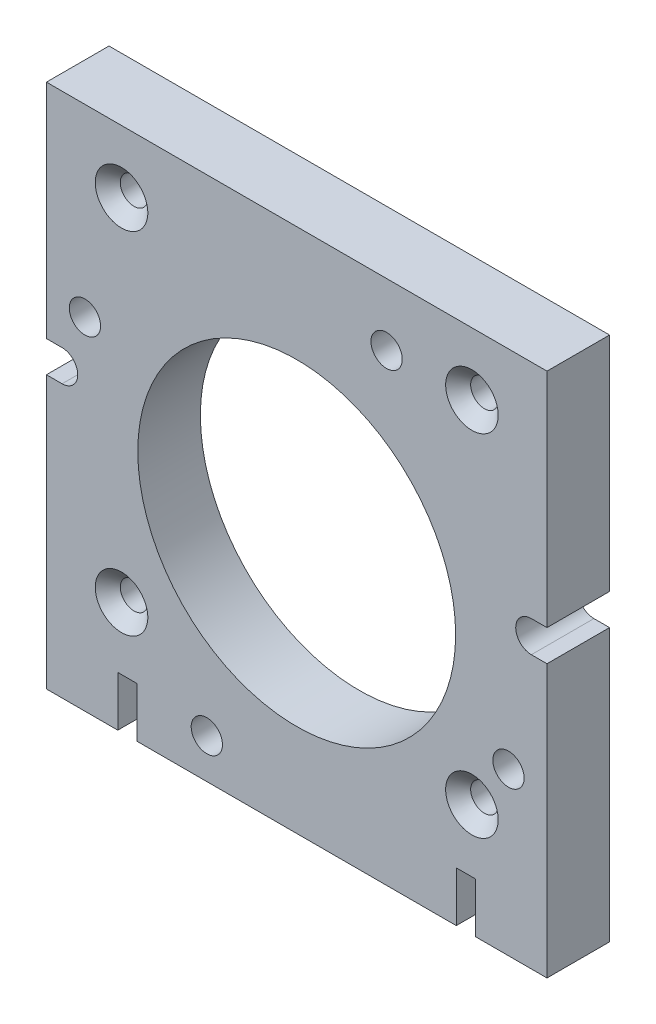
ISO-10303-21;
HEADER;
FILE_DESCRIPTION(('STEP AP214'),'2;1');
FILE_NAME('part.step','',(''),(''),'','','');
FILE_SCHEMA(('AUTOMOTIVE_DESIGN { 1 0 10303 214 1 1 1 1 }'));
ENDSEC;
DATA;
#1=APPLICATION_CONTEXT('core data for automotive mechanical design processes');
#2=APPLICATION_PROTOCOL_DEFINITION('international standard','automotive_design',2000,#1);
#3=PRODUCT_CONTEXT('',#1,'mechanical');
#4=PRODUCT('Part','Part','',(#3));
#5=PRODUCT_RELATED_PRODUCT_CATEGORY('part','',(#4));
#6=PRODUCT_DEFINITION_FORMATION('','',#4);
#7=PRODUCT_DEFINITION_CONTEXT('part definition',#1,'design');
#8=PRODUCT_DEFINITION('design','',#6,#7);
#9=PRODUCT_DEFINITION_SHAPE('','',#8);
#10=(LENGTH_UNIT() NAMED_UNIT(*) SI_UNIT(.MILLI.,.METRE.));
#11=(NAMED_UNIT(*) PLANE_ANGLE_UNIT() SI_UNIT($,.RADIAN.));
#12=(NAMED_UNIT(*) SI_UNIT($,.STERADIAN.) SOLID_ANGLE_UNIT());
#13=UNCERTAINTY_MEASURE_WITH_UNIT(LENGTH_MEASURE(1.E-05),#10,'distance_accuracy_value','');
#14=(GEOMETRIC_REPRESENTATION_CONTEXT(3) GLOBAL_UNCERTAINTY_ASSIGNED_CONTEXT((#13)) GLOBAL_UNIT_ASSIGNED_CONTEXT((#10,
#11,#12)) REPRESENTATION_CONTEXT('',''));
#15=CARTESIAN_POINT('',(0.,0.,0.));
#16=DIRECTION('',(0.,0.,1.));
#17=DIRECTION('',(1.,0.,0.));
#18=AXIS2_PLACEMENT_3D('',#15,#16,#17);
#19=CARTESIAN_POINT('',(20.,10.125,5.));
#20=DIRECTION('',(1.,0.,0.));
#21=DIRECTION('',(0.,1.,0.));
#22=AXIS2_PLACEMENT_3D('',#19,#20,#21);
#23=PLANE('',#22);
#24=DIRECTION('',(0.,-1.,0.));
#25=VECTOR('',#24,1.);
#26=CARTESIAN_POINT('',(20.,10.125,0.));
#27=LINE('',#26,#25);
#28=CARTESIAN_POINT('',(20.,19.,0.));
#29=VERTEX_POINT('',#28);
#30=CARTESIAN_POINT('',(20.,1.25,0.));
#31=VERTEX_POINT('',#30);
#32=EDGE_CURVE('E9',#29,#31,#27,.T.);
#33=ORIENTED_EDGE('',*,*,#32,.F.);
#34=DIRECTION('',(0.,0.,-1.));
#35=VECTOR('',#34,1.);
#36=CARTESIAN_POINT('',(20.,19.,5.));
#37=LINE('',#36,#35);
#38=CARTESIAN_POINT('',(20.,19.,5.));
#39=VERTEX_POINT('',#38);
#40=EDGE_CURVE('E23',#39,#29,#37,.T.);
#41=ORIENTED_EDGE('',*,*,#40,.F.);
#42=DIRECTION('',(0.,-1.,0.));
#43=VECTOR('',#42,1.);
#44=CARTESIAN_POINT('',(20.,10.125,5.));
#45=LINE('',#44,#43);
#46=CARTESIAN_POINT('',(20.,1.25,5.));
#47=VERTEX_POINT('',#46);
#48=EDGE_CURVE('E382',#39,#47,#45,.T.);
#49=ORIENTED_EDGE('',*,*,#48,.T.);
#50=DIRECTION('',(0.,0.,-1.));
#51=VECTOR('',#50,1.);
#52=CARTESIAN_POINT('',(20.,1.25,5.));
#53=LINE('',#52,#51);
#54=EDGE_CURVE('E165',#47,#31,#53,.T.);
#55=ORIENTED_EDGE('',*,*,#54,.T.);
#56=EDGE_LOOP('',(#33,#41,#49,#55));
#57=FACE_BOUND('',#56,.T.);
#58=ADVANCED_FACE('F15',(#57),#23,.T.);
#59=CARTESIAN_POINT('',(0.,19.,5.));
#60=DIRECTION('',(0.,-1.,0.));
#61=DIRECTION('',(1.,0.,0.));
#62=AXIS2_PLACEMENT_3D('',#59,#60,#61);
#63=PLANE('',#62);
#64=DIRECTION('',(-1.,0.,0.));
#65=VECTOR('',#64,1.);
#66=CARTESIAN_POINT('',(0.,19.,0.));
#67=LINE('',#66,#65);
#68=CARTESIAN_POINT('',(-20.,19.,0.));
#69=VERTEX_POINT('',#68);
#70=EDGE_CURVE('E377',#29,#69,#67,.T.);
#71=ORIENTED_EDGE('',*,*,#70,.T.);
#72=DIRECTION('',(0.,0.,-1.));
#73=VECTOR('',#72,1.);
#74=CARTESIAN_POINT('',(-20.,19.,5.));
#75=LINE('',#74,#73);
#76=CARTESIAN_POINT('',(-20.,19.,5.));
#77=VERTEX_POINT('',#76);
#78=EDGE_CURVE('E373',#77,#69,#75,.T.);
#79=ORIENTED_EDGE('',*,*,#78,.F.);
#80=DIRECTION('',(-1.,0.,0.));
#81=VECTOR('',#80,1.);
#82=CARTESIAN_POINT('',(0.,19.,5.));
#83=LINE('',#82,#81);
#84=EDGE_CURVE('E369',#39,#77,#83,.T.);
#85=ORIENTED_EDGE('',*,*,#84,.F.);
#86=ORIENTED_EDGE('',*,*,#40,.T.);
#87=EDGE_LOOP('',(#71,#79,#85,#86));
#88=FACE_BOUND('',#87,.T.);
#89=ADVANCED_FACE('F388',(#88),#63,.F.);
#90=CARTESIAN_POINT('',(-20.,10.125,5.));
#91=DIRECTION('',(1.,0.,0.));
#92=DIRECTION('',(0.,1.,0.));
#93=AXIS2_PLACEMENT_3D('',#90,#91,#92);
#94=PLANE('',#93);
#95=DIRECTION('',(0.,-1.,0.));
#96=VECTOR('',#95,1.);
#97=CARTESIAN_POINT('',(-20.,10.125,0.));
#98=LINE('',#97,#96);
#99=CARTESIAN_POINT('',(-20.,1.25,0.));
#100=VERTEX_POINT('',#99);
#101=EDGE_CURVE('E366',#69,#100,#98,.T.);
#102=ORIENTED_EDGE('',*,*,#101,.T.);
#103=DIRECTION('',(0.,0.,-1.));
#104=VECTOR('',#103,1.);
#105=CARTESIAN_POINT('',(-20.,1.25,5.));
#106=LINE('',#105,#104);
#107=CARTESIAN_POINT('',(-20.,1.25,5.));
#108=VERTEX_POINT('',#107);
#109=EDGE_CURVE('E362',#108,#100,#106,.T.);
#110=ORIENTED_EDGE('',*,*,#109,.F.);
#111=DIRECTION('',(0.,-1.,0.));
#112=VECTOR('',#111,1.);
#113=CARTESIAN_POINT('',(-20.,10.125,5.));
#114=LINE('',#113,#112);
#115=EDGE_CURVE('E358',#77,#108,#114,.T.);
#116=ORIENTED_EDGE('',*,*,#115,.F.);
#117=ORIENTED_EDGE('',*,*,#78,.T.);
#118=EDGE_LOOP('',(#102,#110,#116,#117));
#119=FACE_BOUND('',#118,.T.);
#120=ADVANCED_FACE('F394',(#119),#94,.F.);
#121=CARTESIAN_POINT('',(-19.375,1.25,5.));
#122=DIRECTION('',(0.,-1.,0.));
#123=DIRECTION('',(0.,0.,-1.));
#124=AXIS2_PLACEMENT_3D('',#121,#122,#123);
#125=PLANE('',#124);
#126=DIRECTION('',(-1.,0.,0.));
#127=VECTOR('',#126,1.);
#128=CARTESIAN_POINT('',(-19.375,1.25,0.));
#129=LINE('',#128,#127);
#130=CARTESIAN_POINT('',(-18.75,1.25,0.));
#131=VERTEX_POINT('',#130);
#132=EDGE_CURVE('E354',#131,#100,#129,.T.);
#133=ORIENTED_EDGE('',*,*,#132,.F.);
#134=DIRECTION('',(0.,0.,-1.));
#135=VECTOR('',#134,1.);
#136=CARTESIAN_POINT('',(-18.75,1.25,5.));
#137=LINE('',#136,#135);
#138=CARTESIAN_POINT('',(-18.75,1.25,5.));
#139=VERTEX_POINT('',#138);
#140=EDGE_CURVE('E350',#139,#131,#137,.T.);
#141=ORIENTED_EDGE('',*,*,#140,.F.);
#142=DIRECTION('',(-1.,0.,0.));
#143=VECTOR('',#142,1.);
#144=CARTESIAN_POINT('',(-19.375,1.25,5.));
#145=LINE('',#144,#143);
#146=EDGE_CURVE('E346',#139,#108,#145,.T.);
#147=ORIENTED_EDGE('',*,*,#146,.T.);
#148=ORIENTED_EDGE('',*,*,#109,.T.);
#149=EDGE_LOOP('',(#133,#141,#147,#148));
#150=FACE_BOUND('',#149,.T.);
#151=ADVANCED_FACE('F397',(#150),#125,.T.);
#152=CARTESIAN_POINT('',(-18.75,0.,5.));
#153=DIRECTION('',(0.,0.,-1.));
#154=DIRECTION('',(-1.,0.,0.));
#155=AXIS2_PLACEMENT_3D('',#152,#153,#154);
#156=CYLINDRICAL_SURFACE('',#155,1.25);
#157=CARTESIAN_POINT('',(-18.75,0.,0.));
#158=DIRECTION('',(0.,0.,1.));
#159=DIRECTION('',(1.,0.,0.));
#160=AXIS2_PLACEMENT_3D('',#157,#158,#159);
#161=CIRCLE('',#160,1.25);
#162=CARTESIAN_POINT('',(-18.75,-1.25,0.));
#163=VERTEX_POINT('',#162);
#164=EDGE_CURVE('E342',#163,#131,#161,.T.);
#165=ORIENTED_EDGE('',*,*,#164,.F.);
#166=DIRECTION('',(0.,0.,-1.));
#167=VECTOR('',#166,1.);
#168=CARTESIAN_POINT('',(-18.75,-1.25,5.));
#169=LINE('',#168,#167);
#170=CARTESIAN_POINT('',(-18.75,-1.25,5.));
#171=VERTEX_POINT('',#170);
#172=EDGE_CURVE('E338',#171,#163,#169,.T.);
#173=ORIENTED_EDGE('',*,*,#172,.F.);
#174=CARTESIAN_POINT('',(-18.75,0.,5.));
#175=DIRECTION('',(0.,0.,1.));
#176=DIRECTION('',(1.,0.,0.));
#177=AXIS2_PLACEMENT_3D('',#174,#175,#176);
#178=CIRCLE('',#177,1.25);
#179=EDGE_CURVE('E334',#171,#139,#178,.T.);
#180=ORIENTED_EDGE('',*,*,#179,.T.);
#181=ORIENTED_EDGE('',*,*,#140,.T.);
#182=EDGE_LOOP('',(#165,#173,#180,#181));
#183=FACE_BOUND('',#182,.T.);
#184=ADVANCED_FACE('F538',(#183),#156,.F.);
#185=CARTESIAN_POINT('',(-19.375,-1.25,5.));
#186=DIRECTION('',(0.,-1.,0.));
#187=DIRECTION('',(0.,0.,-1.));
#188=AXIS2_PLACEMENT_3D('',#185,#186,#187);
#189=PLANE('',#188);
#190=DIRECTION('',(-1.,0.,0.));
#191=VECTOR('',#190,1.);
#192=CARTESIAN_POINT('',(-19.375,-1.25,0.));
#193=LINE('',#192,#191);
#194=CARTESIAN_POINT('',(-20.,-1.25,0.));
#195=VERTEX_POINT('',#194);
#196=EDGE_CURVE('E331',#163,#195,#193,.T.);
#197=ORIENTED_EDGE('',*,*,#196,.T.);
#198=DIRECTION('',(0.,0.,-1.));
#199=VECTOR('',#198,1.);
#200=CARTESIAN_POINT('',(-20.,-1.25,5.));
#201=LINE('',#200,#199);
#202=CARTESIAN_POINT('',(-20.,-1.25,5.));
#203=VERTEX_POINT('',#202);
#204=EDGE_CURVE('E327',#203,#195,#201,.T.);
#205=ORIENTED_EDGE('',*,*,#204,.F.);
#206=DIRECTION('',(-1.,0.,0.));
#207=VECTOR('',#206,1.);
#208=CARTESIAN_POINT('',(-19.375,-1.25,5.));
#209=LINE('',#208,#207);
#210=EDGE_CURVE('E323',#171,#203,#209,.T.);
#211=ORIENTED_EDGE('',*,*,#210,.F.);
#212=ORIENTED_EDGE('',*,*,#172,.T.);
#213=EDGE_LOOP('',(#197,#205,#211,#212));
#214=FACE_BOUND('',#213,.T.);
#215=ADVANCED_FACE('F541',(#214),#189,.F.);
#216=CARTESIAN_POINT('',(-20.,-10.125,5.));
#217=DIRECTION('',(1.,0.,0.));
#218=DIRECTION('',(0.,1.,0.));
#219=AXIS2_PLACEMENT_3D('',#216,#217,#218);
#220=PLANE('',#219);
#221=DIRECTION('',(0.,-1.,0.));
#222=VECTOR('',#221,1.);
#223=CARTESIAN_POINT('',(-20.,-10.125,0.));
#224=LINE('',#223,#222);
#225=CARTESIAN_POINT('',(-20.,-23.,0.));
#226=VERTEX_POINT('',#225);
#227=EDGE_CURVE('E320',#195,#226,#224,.T.);
#228=ORIENTED_EDGE('',*,*,#227,.T.);
#229=DIRECTION('',(0.,0.,-1.));
#230=VECTOR('',#229,1.);
#231=CARTESIAN_POINT('',(-20.,-23.,5.));
#232=LINE('',#231,#230);
#233=CARTESIAN_POINT('',(-20.,-23.,5.));
#234=VERTEX_POINT('',#233);
#235=EDGE_CURVE('E316',#234,#226,#232,.T.);
#236=ORIENTED_EDGE('',*,*,#235,.F.);
#237=DIRECTION('',(0.,-1.,0.));
#238=VECTOR('',#237,1.);
#239=CARTESIAN_POINT('',(-20.,-10.125,5.));
#240=LINE('',#239,#238);
#241=EDGE_CURVE('E312',#203,#234,#240,.T.);
#242=ORIENTED_EDGE('',*,*,#241,.F.);
#243=ORIENTED_EDGE('',*,*,#204,.T.);
#244=EDGE_LOOP('',(#228,#236,#242,#243));
#245=FACE_BOUND('',#244,.T.);
#246=ADVANCED_FACE('F545',(#245),#220,.F.);
#247=CARTESIAN_POINT('',(-17.15,-23.,5.));
#248=DIRECTION('',(0.,1.,0.));
#249=DIRECTION('',(0.,0.,1.));
#250=AXIS2_PLACEMENT_3D('',#247,#248,#249);
#251=PLANE('',#250);
#252=DIRECTION('',(1.,0.,0.));
#253=VECTOR('',#252,1.);
#254=CARTESIAN_POINT('',(-17.15,-23.,0.));
#255=LINE('',#254,#253);
#256=CARTESIAN_POINT('',(-14.3,-23.,0.));
#257=VERTEX_POINT('',#256);
#258=EDGE_CURVE('E309',#226,#257,#255,.T.);
#259=ORIENTED_EDGE('',*,*,#258,.T.);
#260=DIRECTION('',(0.,0.,-1.));
#261=VECTOR('',#260,1.);
#262=CARTESIAN_POINT('',(-14.3,-23.,5.));
#263=LINE('',#262,#261);
#264=CARTESIAN_POINT('',(-14.3,-23.,5.));
#265=VERTEX_POINT('',#264);
#266=EDGE_CURVE('E305',#265,#257,#263,.T.);
#267=ORIENTED_EDGE('',*,*,#266,.F.);
#268=DIRECTION('',(1.,0.,0.));
#269=VECTOR('',#268,1.);
#270=CARTESIAN_POINT('',(-17.15,-23.,5.));
#271=LINE('',#270,#269);
#272=EDGE_CURVE('E301',#234,#265,#271,.T.);
#273=ORIENTED_EDGE('',*,*,#272,.F.);
#274=ORIENTED_EDGE('',*,*,#235,.T.);
#275=EDGE_LOOP('',(#259,#267,#273,#274));
#276=FACE_BOUND('',#275,.T.);
#277=ADVANCED_FACE('F549',(#276),#251,.F.);
#278=CARTESIAN_POINT('',(-14.3,-21.,5.));
#279=DIRECTION('',(-1.,0.,0.));
#280=DIRECTION('',(0.,0.,1.));
#281=AXIS2_PLACEMENT_3D('',#278,#279,#280);
#282=PLANE('',#281);
#283=DIRECTION('',(0.,1.,0.));
#284=VECTOR('',#283,1.);
#285=CARTESIAN_POINT('',(-14.3,-21.,0.));
#286=LINE('',#285,#284);
#287=CARTESIAN_POINT('',(-14.3,-19.,0.));
#288=VERTEX_POINT('',#287);
#289=EDGE_CURVE('E298',#257,#288,#286,.T.);
#290=ORIENTED_EDGE('',*,*,#289,.T.);
#291=DIRECTION('',(0.,0.,-1.));
#292=VECTOR('',#291,1.);
#293=CARTESIAN_POINT('',(-14.3,-19.,5.));
#294=LINE('',#293,#292);
#295=CARTESIAN_POINT('',(-14.3,-19.,5.));
#296=VERTEX_POINT('',#295);
#297=EDGE_CURVE('E294',#296,#288,#294,.T.);
#298=ORIENTED_EDGE('',*,*,#297,.F.);
#299=DIRECTION('',(0.,1.,0.));
#300=VECTOR('',#299,1.);
#301=CARTESIAN_POINT('',(-14.3,-21.,5.));
#302=LINE('',#301,#300);
#303=EDGE_CURVE('E290',#265,#296,#302,.T.);
#304=ORIENTED_EDGE('',*,*,#303,.F.);
#305=ORIENTED_EDGE('',*,*,#266,.T.);
#306=EDGE_LOOP('',(#290,#298,#304,#305));
#307=FACE_BOUND('',#306,.T.);
#308=ADVANCED_FACE('F553',(#307),#282,.F.);
#309=CARTESIAN_POINT('',(-13.525,-19.,5.));
#310=DIRECTION('',(0.,1.,0.));
#311=DIRECTION('',(0.,0.,1.));
#312=AXIS2_PLACEMENT_3D('',#309,#310,#311);
#313=PLANE('',#312);
#314=DIRECTION('',(1.,0.,0.));
#315=VECTOR('',#314,1.);
#316=CARTESIAN_POINT('',(-13.525,-19.,0.));
#317=LINE('',#316,#315);
#318=CARTESIAN_POINT('',(-12.75,-19.,0.));
#319=VERTEX_POINT('',#318);
#320=EDGE_CURVE('E287',#288,#319,#317,.T.);
#321=ORIENTED_EDGE('',*,*,#320,.T.);
#322=DIRECTION('',(0.,0.,-1.));
#323=VECTOR('',#322,1.);
#324=CARTESIAN_POINT('',(-12.75,-19.,5.));
#325=LINE('',#324,#323);
#326=CARTESIAN_POINT('',(-12.75,-19.,5.));
#327=VERTEX_POINT('',#326);
#328=EDGE_CURVE('E283',#327,#319,#325,.T.);
#329=ORIENTED_EDGE('',*,*,#328,.F.);
#330=DIRECTION('',(1.,0.,0.));
#331=VECTOR('',#330,1.);
#332=CARTESIAN_POINT('',(-13.525,-19.,5.));
#333=LINE('',#332,#331);
#334=EDGE_CURVE('E279',#296,#327,#333,.T.);
#335=ORIENTED_EDGE('',*,*,#334,.F.);
#336=ORIENTED_EDGE('',*,*,#297,.T.);
#337=EDGE_LOOP('',(#321,#329,#335,#336));
#338=FACE_BOUND('',#337,.T.);
#339=ADVANCED_FACE('F557',(#338),#313,.F.);
#340=CARTESIAN_POINT('',(-12.75,-21.,5.));
#341=DIRECTION('',(-1.,0.,0.));
#342=DIRECTION('',(0.,0.,1.));
#343=AXIS2_PLACEMENT_3D('',#340,#341,#342);
#344=PLANE('',#343);
#345=DIRECTION('',(0.,1.,0.));
#346=VECTOR('',#345,1.);
#347=CARTESIAN_POINT('',(-12.75,-21.,0.));
#348=LINE('',#347,#346);
#349=CARTESIAN_POINT('',(-12.75,-23.,0.));
#350=VERTEX_POINT('',#349);
#351=EDGE_CURVE('E275',#350,#319,#348,.T.);
#352=ORIENTED_EDGE('',*,*,#351,.F.);
#353=DIRECTION('',(0.,0.,-1.));
#354=VECTOR('',#353,1.);
#355=CARTESIAN_POINT('',(-12.75,-23.,5.));
#356=LINE('',#355,#354);
#357=CARTESIAN_POINT('',(-12.75,-23.,5.));
#358=VERTEX_POINT('',#357);
#359=EDGE_CURVE('E271',#358,#350,#356,.T.);
#360=ORIENTED_EDGE('',*,*,#359,.F.);
#361=DIRECTION('',(0.,1.,0.));
#362=VECTOR('',#361,1.);
#363=CARTESIAN_POINT('',(-12.75,-21.,5.));
#364=LINE('',#363,#362);
#365=EDGE_CURVE('E267',#358,#327,#364,.T.);
#366=ORIENTED_EDGE('',*,*,#365,.T.);
#367=ORIENTED_EDGE('',*,*,#328,.T.);
#368=EDGE_LOOP('',(#352,#360,#366,#367));
#369=FACE_BOUND('',#368,.T.);
#370=ADVANCED_FACE('F561',(#369),#344,.T.);
#371=CARTESIAN_POINT('',(0.,-23.,5.));
#372=DIRECTION('',(0.,1.,0.));
#373=DIRECTION('',(0.,0.,1.));
#374=AXIS2_PLACEMENT_3D('',#371,#372,#373);
#375=PLANE('',#374);
#376=DIRECTION('',(1.,0.,0.));
#377=VECTOR('',#376,1.);
#378=CARTESIAN_POINT('',(0.,-23.,0.));
#379=LINE('',#378,#377);
#380=CARTESIAN_POINT('',(12.75,-23.,0.));
#381=VERTEX_POINT('',#380);
#382=EDGE_CURVE('E264',#350,#381,#379,.T.);
#383=ORIENTED_EDGE('',*,*,#382,.T.);
#384=DIRECTION('',(0.,0.,-1.));
#385=VECTOR('',#384,1.);
#386=CARTESIAN_POINT('',(12.75,-23.,5.));
#387=LINE('',#386,#385);
#388=CARTESIAN_POINT('',(12.75,-23.,5.));
#389=VERTEX_POINT('',#388);
#390=EDGE_CURVE('E260',#389,#381,#387,.T.);
#391=ORIENTED_EDGE('',*,*,#390,.F.);
#392=DIRECTION('',(1.,0.,0.));
#393=VECTOR('',#392,1.);
#394=CARTESIAN_POINT('',(0.,-23.,5.));
#395=LINE('',#394,#393);
#396=EDGE_CURVE('E256',#358,#389,#395,.T.);
#397=ORIENTED_EDGE('',*,*,#396,.F.);
#398=ORIENTED_EDGE('',*,*,#359,.T.);
#399=EDGE_LOOP('',(#383,#391,#397,#398));
#400=FACE_BOUND('',#399,.T.);
#401=ADVANCED_FACE('F565',(#400),#375,.F.);
#402=CARTESIAN_POINT('',(12.75,-21.,5.));
#403=DIRECTION('',(-1.,0.,0.));
#404=DIRECTION('',(0.,0.,1.));
#405=AXIS2_PLACEMENT_3D('',#402,#403,#404);
#406=PLANE('',#405);
#407=DIRECTION('',(0.,1.,0.));
#408=VECTOR('',#407,1.);
#409=CARTESIAN_POINT('',(12.75,-21.,0.));
#410=LINE('',#409,#408);
#411=CARTESIAN_POINT('',(12.75,-19.,0.));
#412=VERTEX_POINT('',#411);
#413=EDGE_CURVE('E253',#381,#412,#410,.T.);
#414=ORIENTED_EDGE('',*,*,#413,.T.);
#415=DIRECTION('',(0.,0.,-1.));
#416=VECTOR('',#415,1.);
#417=CARTESIAN_POINT('',(12.75,-19.,5.));
#418=LINE('',#417,#416);
#419=CARTESIAN_POINT('',(12.75,-19.,5.));
#420=VERTEX_POINT('',#419);
#421=EDGE_CURVE('E249',#420,#412,#418,.T.);
#422=ORIENTED_EDGE('',*,*,#421,.F.);
#423=DIRECTION('',(0.,1.,0.));
#424=VECTOR('',#423,1.);
#425=CARTESIAN_POINT('',(12.75,-21.,5.));
#426=LINE('',#425,#424);
#427=EDGE_CURVE('E245',#389,#420,#426,.T.);
#428=ORIENTED_EDGE('',*,*,#427,.F.);
#429=ORIENTED_EDGE('',*,*,#390,.T.);
#430=EDGE_LOOP('',(#414,#422,#428,#429));
#431=FACE_BOUND('',#430,.T.);
#432=ADVANCED_FACE('F569',(#431),#406,.F.);
#433=CARTESIAN_POINT('',(13.525,-19.,5.));
#434=DIRECTION('',(0.,1.,0.));
#435=DIRECTION('',(0.,0.,1.));
#436=AXIS2_PLACEMENT_3D('',#433,#434,#435);
#437=PLANE('',#436);
#438=DIRECTION('',(1.,0.,0.));
#439=VECTOR('',#438,1.);
#440=CARTESIAN_POINT('',(13.525,-19.,0.));
#441=LINE('',#440,#439);
#442=CARTESIAN_POINT('',(14.3,-19.,0.));
#443=VERTEX_POINT('',#442);
#444=EDGE_CURVE('E242',#412,#443,#441,.T.);
#445=ORIENTED_EDGE('',*,*,#444,.T.);
#446=DIRECTION('',(0.,0.,-1.));
#447=VECTOR('',#446,1.);
#448=CARTESIAN_POINT('',(14.3,-19.,5.));
#449=LINE('',#448,#447);
#450=CARTESIAN_POINT('',(14.3,-19.,5.));
#451=VERTEX_POINT('',#450);
#452=EDGE_CURVE('E238',#451,#443,#449,.T.);
#453=ORIENTED_EDGE('',*,*,#452,.F.);
#454=DIRECTION('',(1.,0.,0.));
#455=VECTOR('',#454,1.);
#456=CARTESIAN_POINT('',(13.525,-19.,5.));
#457=LINE('',#456,#455);
#458=EDGE_CURVE('E234',#420,#451,#457,.T.);
#459=ORIENTED_EDGE('',*,*,#458,.F.);
#460=ORIENTED_EDGE('',*,*,#421,.T.);
#461=EDGE_LOOP('',(#445,#453,#459,#460));
#462=FACE_BOUND('',#461,.T.);
#463=ADVANCED_FACE('F573',(#462),#437,.F.);
#464=CARTESIAN_POINT('',(14.3,-21.,5.));
#465=DIRECTION('',(-1.,0.,0.));
#466=DIRECTION('',(0.,0.,1.));
#467=AXIS2_PLACEMENT_3D('',#464,#465,#466);
#468=PLANE('',#467);
#469=DIRECTION('',(0.,1.,0.));
#470=VECTOR('',#469,1.);
#471=CARTESIAN_POINT('',(14.3,-21.,0.));
#472=LINE('',#471,#470);
#473=CARTESIAN_POINT('',(14.3,-23.,0.));
#474=VERTEX_POINT('',#473);
#475=EDGE_CURVE('E230',#474,#443,#472,.T.);
#476=ORIENTED_EDGE('',*,*,#475,.F.);
#477=DIRECTION('',(0.,0.,-1.));
#478=VECTOR('',#477,1.);
#479=CARTESIAN_POINT('',(14.3,-23.,5.));
#480=LINE('',#479,#478);
#481=CARTESIAN_POINT('',(14.3,-23.,5.));
#482=VERTEX_POINT('',#481);
#483=EDGE_CURVE('E226',#482,#474,#480,.T.);
#484=ORIENTED_EDGE('',*,*,#483,.F.);
#485=DIRECTION('',(0.,1.,0.));
#486=VECTOR('',#485,1.);
#487=CARTESIAN_POINT('',(14.3,-21.,5.));
#488=LINE('',#487,#486);
#489=EDGE_CURVE('E222',#482,#451,#488,.T.);
#490=ORIENTED_EDGE('',*,*,#489,.T.);
#491=ORIENTED_EDGE('',*,*,#452,.T.);
#492=EDGE_LOOP('',(#476,#484,#490,#491));
#493=FACE_BOUND('',#492,.T.);
#494=ADVANCED_FACE('F577',(#493),#468,.T.);
#495=CARTESIAN_POINT('',(17.15,-23.,5.));
#496=DIRECTION('',(0.,1.,0.));
#497=DIRECTION('',(0.,0.,1.));
#498=AXIS2_PLACEMENT_3D('',#495,#496,#497);
#499=PLANE('',#498);
#500=DIRECTION('',(1.,0.,0.));
#501=VECTOR('',#500,1.);
#502=CARTESIAN_POINT('',(17.15,-23.,0.));
#503=LINE('',#502,#501);
#504=CARTESIAN_POINT('',(20.,-23.,0.));
#505=VERTEX_POINT('',#504);
#506=EDGE_CURVE('E219',#474,#505,#503,.T.);
#507=ORIENTED_EDGE('',*,*,#506,.T.);
#508=DIRECTION('',(0.,0.,-1.));
#509=VECTOR('',#508,1.);
#510=CARTESIAN_POINT('',(20.,-23.,5.));
#511=LINE('',#510,#509);
#512=CARTESIAN_POINT('',(20.,-23.,5.));
#513=VERTEX_POINT('',#512);
#514=EDGE_CURVE('E215',#513,#505,#511,.T.);
#515=ORIENTED_EDGE('',*,*,#514,.F.);
#516=DIRECTION('',(1.,0.,0.));
#517=VECTOR('',#516,1.);
#518=CARTESIAN_POINT('',(17.15,-23.,5.));
#519=LINE('',#518,#517);
#520=EDGE_CURVE('E211',#482,#513,#519,.T.);
#521=ORIENTED_EDGE('',*,*,#520,.F.);
#522=ORIENTED_EDGE('',*,*,#483,.T.);
#523=EDGE_LOOP('',(#507,#515,#521,#522));
#524=FACE_BOUND('',#523,.T.);
#525=ADVANCED_FACE('F581',(#524),#499,.F.);
#526=CARTESIAN_POINT('',(20.,-21.,5.));
#527=DIRECTION('',(1.,0.,0.));
#528=DIRECTION('',(0.,0.,-1.));
#529=AXIS2_PLACEMENT_3D('',#526,#527,#528);
#530=PLANE('',#529);
#531=DIRECTION('',(0.,-1.,0.));
#532=VECTOR('',#531,1.);
#533=CARTESIAN_POINT('',(20.,-21.,0.));
#534=LINE('',#533,#532);
#535=CARTESIAN_POINT('',(20.,-1.25,0.));
#536=VERTEX_POINT('',#535);
#537=EDGE_CURVE('E207',#536,#505,#534,.T.);
#538=ORIENTED_EDGE('',*,*,#537,.F.);
#539=DIRECTION('',(0.,0.,-1.));
#540=VECTOR('',#539,1.);
#541=CARTESIAN_POINT('',(20.,-1.25,5.));
#542=LINE('',#541,#540);
#543=CARTESIAN_POINT('',(20.,-1.25,5.));
#544=VERTEX_POINT('',#543);
#545=EDGE_CURVE('E203',#544,#536,#542,.T.);
#546=ORIENTED_EDGE('',*,*,#545,.F.);
#547=DIRECTION('',(0.,-1.,0.));
#548=VECTOR('',#547,1.);
#549=CARTESIAN_POINT('',(20.,-21.,5.));
#550=LINE('',#549,#548);
#551=EDGE_CURVE('E199',#544,#513,#550,.T.);
#552=ORIENTED_EDGE('',*,*,#551,.T.);
#553=ORIENTED_EDGE('',*,*,#514,.T.);
#554=EDGE_LOOP('',(#538,#546,#552,#553));
#555=FACE_BOUND('',#554,.T.);
#556=ADVANCED_FACE('F585',(#555),#530,.T.);
#557=CARTESIAN_POINT('',(19.375,-1.25,5.));
#558=DIRECTION('',(0.,1.,0.));
#559=DIRECTION('',(0.,0.,1.));
#560=AXIS2_PLACEMENT_3D('',#557,#558,#559);
#561=PLANE('',#560);
#562=DIRECTION('',(1.,0.,0.));
#563=VECTOR('',#562,1.);
#564=CARTESIAN_POINT('',(19.375,-1.25,0.));
#565=LINE('',#564,#563);
#566=CARTESIAN_POINT('',(18.75,-1.25,0.));
#567=VERTEX_POINT('',#566);
#568=EDGE_CURVE('E195',#567,#536,#565,.T.);
#569=ORIENTED_EDGE('',*,*,#568,.F.);
#570=DIRECTION('',(0.,0.,-1.));
#571=VECTOR('',#570,1.);
#572=CARTESIAN_POINT('',(18.75,-1.25,5.));
#573=LINE('',#572,#571);
#574=CARTESIAN_POINT('',(18.75,-1.25,5.));
#575=VERTEX_POINT('',#574);
#576=EDGE_CURVE('E192',#575,#567,#573,.T.);
#577=ORIENTED_EDGE('',*,*,#576,.F.);
#578=DIRECTION('',(1.,0.,0.));
#579=VECTOR('',#578,1.);
#580=CARTESIAN_POINT('',(19.375,-1.25,5.));
#581=LINE('',#580,#579);
#582=EDGE_CURVE('E176',#575,#544,#581,.T.);
#583=ORIENTED_EDGE('',*,*,#582,.T.);
#584=ORIENTED_EDGE('',*,*,#545,.T.);
#585=EDGE_LOOP('',(#569,#577,#583,#584));
#586=FACE_BOUND('',#585,.T.);
#587=ADVANCED_FACE('F589',(#586),#561,.T.);
#588=CARTESIAN_POINT('',(18.75,0.,5.));
#589=DIRECTION('',(0.,0.,-1.));
#590=DIRECTION('',(-1.,0.,0.));
#591=AXIS2_PLACEMENT_3D('',#588,#589,#590);
#592=CYLINDRICAL_SURFACE('',#591,1.25);
#593=CARTESIAN_POINT('',(18.75,0.,0.));
#594=DIRECTION('',(0.,0.,1.));
#595=DIRECTION('',(1.,0.,0.));
#596=AXIS2_PLACEMENT_3D('',#593,#594,#595);
#597=CIRCLE('',#596,1.25);
#598=CARTESIAN_POINT('',(18.75,1.25,0.));
#599=VERTEX_POINT('',#598);
#600=EDGE_CURVE('E155',#599,#567,#597,.T.);
#601=ORIENTED_EDGE('',*,*,#600,.F.);
#602=DIRECTION('',(0.,0.,-1.));
#603=VECTOR('',#602,1.);
#604=CARTESIAN_POINT('',(18.75,1.25,5.));
#605=LINE('',#604,#603);
#606=CARTESIAN_POINT('',(18.75,1.25,5.));
#607=VERTEX_POINT('',#606);
#608=EDGE_CURVE('E147',#607,#599,#605,.T.);
#609=ORIENTED_EDGE('',*,*,#608,.F.);
#610=CARTESIAN_POINT('',(18.75,0.,5.));
#611=DIRECTION('',(0.,0.,1.));
#612=DIRECTION('',(1.,0.,0.));
#613=AXIS2_PLACEMENT_3D('',#610,#611,#612);
#614=CIRCLE('',#613,1.25);
#615=EDGE_CURVE('E152',#607,#575,#614,.T.);
#616=ORIENTED_EDGE('',*,*,#615,.T.);
#617=ORIENTED_EDGE('',*,*,#576,.T.);
#618=EDGE_LOOP('',(#601,#609,#616,#617));
#619=FACE_BOUND('',#618,.T.);
#620=ADVANCED_FACE('F149',(#619),#592,.F.);
#621=CARTESIAN_POINT('',(0.,-2.9,5.));
#622=DIRECTION('',(0.,0.,-1.));
#623=DIRECTION('',(-1.,0.,0.));
#624=AXIS2_PLACEMENT_3D('',#621,#622,#623);
#625=CYLINDRICAL_SURFACE('',#624,12.7);
#626=CARTESIAN_POINT('',(0.,-2.9,5.));
#627=DIRECTION('',(0.,0.,1.));
#628=DIRECTION('',(1.,0.,0.));
#629=AXIS2_PLACEMENT_3D('',#626,#627,#628);
#630=CIRCLE('',#629,12.7);
#631=CARTESIAN_POINT('',(12.7,-2.9,5.));
#632=VERTEX_POINT('',#631);
#633=EDGE_CURVE('E178',#632,#632,#630,.T.);
#634=ORIENTED_EDGE('',*,*,#633,.T.);
#635=EDGE_LOOP('',(#634));
#636=FACE_BOUND('',#635,.T.);
#637=CARTESIAN_POINT('',(0.,-2.9,0.));
#638=DIRECTION('',(0.,0.,1.));
#639=DIRECTION('',(1.,0.,0.));
#640=AXIS2_PLACEMENT_3D('',#637,#638,#639);
#641=CIRCLE('',#640,12.7);
#642=CARTESIAN_POINT('',(12.7,-2.9,0.));
#643=VERTEX_POINT('',#642);
#644=EDGE_CURVE('E184',#643,#643,#641,.T.);
#645=ORIENTED_EDGE('',*,*,#644,.F.);
#646=EDGE_LOOP('',(#645));
#647=FACE_BOUND('',#646,.T.);
#648=ADVANCED_FACE('F596',(#636,#647),#625,.F.);
#649=CARTESIAN_POINT('',(19.375,1.25,5.));
#650=DIRECTION('',(0.,1.,0.));
#651=DIRECTION('',(0.,0.,1.));
#652=AXIS2_PLACEMENT_3D('',#649,#650,#651);
#653=PLANE('',#652);
#654=DIRECTION('',(1.,0.,0.));
#655=VECTOR('',#654,1.);
#656=CARTESIAN_POINT('',(19.375,1.25,0.));
#657=LINE('',#656,#655);
#658=EDGE_CURVE('E169',#599,#31,#657,.T.);
#659=ORIENTED_EDGE('',*,*,#658,.T.);
#660=ORIENTED_EDGE('',*,*,#54,.F.);
#661=DIRECTION('',(1.,0.,0.));
#662=VECTOR('',#661,1.);
#663=CARTESIAN_POINT('',(19.375,1.25,5.));
#664=LINE('',#663,#662);
#665=EDGE_CURVE('E163',#607,#47,#664,.T.);
#666=ORIENTED_EDGE('',*,*,#665,.F.);
#667=ORIENTED_EDGE('',*,*,#608,.T.);
#668=EDGE_LOOP('',(#659,#660,#666,#667));
#669=FACE_BOUND('',#668,.T.);
#670=ADVANCED_FACE('F164',(#669),#653,.F.);
#671=CARTESIAN_POINT('',(0.,-2.89999999999996,5.));
#672=DIRECTION('',(0.,0.,1.));
#673=DIRECTION('',(1.,0.,0.));
#674=AXIS2_PLACEMENT_3D('',#671,#672,#673);
#675=PLANE('',#674);
#676=CARTESIAN_POINT('',(-14.,-14.,5.));
#677=DIRECTION('',(0.,0.,-1.));
#678=DIRECTION('',(-1.,0.,0.));
#679=AXIS2_PLACEMENT_3D('',#676,#677,#678);
#680=CIRCLE('',#679,2.1);
#681=CARTESIAN_POINT('',(-16.1,-14.,5.));
#682=VERTEX_POINT('',#681);
#683=EDGE_CURVE('E170',#682,#682,#680,.T.);
#684=ORIENTED_EDGE('',*,*,#683,.T.);
#685=EDGE_LOOP('',(#684));
#686=FACE_BOUND('',#685,.T.);
#687=CARTESIAN_POINT('',(14.,-14.,5.));
#688=DIRECTION('',(0.,0.,-1.));
#689=DIRECTION('',(-1.,0.,0.));
#690=AXIS2_PLACEMENT_3D('',#687,#688,#689);
#691=CIRCLE('',#690,2.1);
#692=CARTESIAN_POINT('',(11.9,-14.,5.));
#693=VERTEX_POINT('',#692);
#694=EDGE_CURVE('E409',#693,#693,#691,.T.);
#695=ORIENTED_EDGE('',*,*,#694,.T.);
#696=EDGE_LOOP('',(#695));
#697=FACE_BOUND('',#696,.T.);
#698=CARTESIAN_POINT('',(14.,14.,5.));
#699=DIRECTION('',(0.,0.,-1.));
#700=DIRECTION('',(-1.,0.,0.));
#701=AXIS2_PLACEMENT_3D('',#698,#699,#700);
#702=CIRCLE('',#701,2.1);
#703=CARTESIAN_POINT('',(11.9,14.,5.));
#704=VERTEX_POINT('',#703);
#705=EDGE_CURVE('E413',#704,#704,#702,.T.);
#706=ORIENTED_EDGE('',*,*,#705,.T.);
#707=EDGE_LOOP('',(#706));
#708=FACE_BOUND('',#707,.T.);
#709=CARTESIAN_POINT('',(-14.,14.,5.));
#710=DIRECTION('',(0.,0.,-1.));
#711=DIRECTION('',(-1.,0.,0.));
#712=AXIS2_PLACEMENT_3D('',#709,#710,#711);
#713=CIRCLE('',#712,2.1);
#714=CARTESIAN_POINT('',(-16.1,14.,5.));
#715=VERTEX_POINT('',#714);
#716=EDGE_CURVE('E417',#715,#715,#713,.T.);
#717=ORIENTED_EDGE('',*,*,#716,.T.);
#718=EDGE_LOOP('',(#717));
#719=FACE_BOUND('',#718,.T.);
#720=CARTESIAN_POINT('',(-7.18350439496138,-19.8232758237751,5.));
#721=DIRECTION('',(0.,0.,1.));
#722=DIRECTION('',(1.,0.,0.));
#723=AXIS2_PLACEMENT_3D('',#720,#721,#722);
#724=CIRCLE('',#723,1.25);
#725=CARTESIAN_POINT('',(-5.93350439496138,-19.8232758237751,5.));
#726=VERTEX_POINT('',#725);
#727=EDGE_CURVE('E421',#726,#726,#724,.F.);
#728=ORIENTED_EDGE('',*,*,#727,.T.);
#729=EDGE_LOOP('',(#728));
#730=FACE_BOUND('',#729,.T.);
#731=CARTESIAN_POINT('',(16.9232758237751,-10.0835043949614,5.));
#732=DIRECTION('',(0.,0.,1.));
#733=DIRECTION('',(1.,0.,0.));
#734=AXIS2_PLACEMENT_3D('',#731,#732,#733);
#735=CIRCLE('',#734,1.25);
#736=CARTESIAN_POINT('',(18.1732758237751,-10.0835043949614,5.));
#737=VERTEX_POINT('',#736);
#738=EDGE_CURVE('E425',#737,#737,#735,.F.);
#739=ORIENTED_EDGE('',*,*,#738,.T.);
#740=EDGE_LOOP('',(#739));
#741=FACE_BOUND('',#740,.T.);
#742=CARTESIAN_POINT('',(-16.9232758237751,4.28350439496139,5.));
#743=DIRECTION('',(0.,0.,1.));
#744=DIRECTION('',(1.,0.,0.));
#745=AXIS2_PLACEMENT_3D('',#742,#743,#744);
#746=CIRCLE('',#745,1.25);
#747=CARTESIAN_POINT('',(-15.6732758237751,4.28350439496139,5.));
#748=VERTEX_POINT('',#747);
#749=EDGE_CURVE('E429',#748,#748,#746,.F.);
#750=ORIENTED_EDGE('',*,*,#749,.T.);
#751=EDGE_LOOP('',(#750));
#752=FACE_BOUND('',#751,.T.);
#753=CARTESIAN_POINT('',(7.18350439496138,14.0232758237751,5.));
#754=DIRECTION('',(0.,0.,1.));
#755=DIRECTION('',(1.,0.,0.));
#756=AXIS2_PLACEMENT_3D('',#753,#754,#755);
#757=CIRCLE('',#756,1.25);
#758=CARTESIAN_POINT('',(8.43350439496138,14.0232758237751,5.));
#759=VERTEX_POINT('',#758);
#760=EDGE_CURVE('E433',#759,#759,#757,.F.);
#761=ORIENTED_EDGE('',*,*,#760,.T.);
#762=EDGE_LOOP('',(#761));
#763=FACE_BOUND('',#762,.T.);
#764=ORIENTED_EDGE('',*,*,#48,.F.);
#765=ORIENTED_EDGE('',*,*,#84,.T.);
#766=ORIENTED_EDGE('',*,*,#115,.T.);
#767=ORIENTED_EDGE('',*,*,#146,.F.);
#768=ORIENTED_EDGE('',*,*,#179,.F.);
#769=ORIENTED_EDGE('',*,*,#210,.T.);
#770=ORIENTED_EDGE('',*,*,#241,.T.);
#771=ORIENTED_EDGE('',*,*,#272,.T.);
#772=ORIENTED_EDGE('',*,*,#303,.T.);
#773=ORIENTED_EDGE('',*,*,#334,.T.);
#774=ORIENTED_EDGE('',*,*,#365,.F.);
#775=ORIENTED_EDGE('',*,*,#396,.T.);
#776=ORIENTED_EDGE('',*,*,#427,.T.);
#777=ORIENTED_EDGE('',*,*,#458,.T.);
#778=ORIENTED_EDGE('',*,*,#489,.F.);
#779=ORIENTED_EDGE('',*,*,#520,.T.);
#780=ORIENTED_EDGE('',*,*,#551,.F.);
#781=ORIENTED_EDGE('',*,*,#582,.F.);
#782=ORIENTED_EDGE('',*,*,#615,.F.);
#783=ORIENTED_EDGE('',*,*,#665,.T.);
#784=EDGE_LOOP('',(#764,#765,#766,#767,#768,#769,#770,#771,#772,#773,#774,#775,#776,#777,#778,
#779,#780,#781,#782,#783));
#785=FACE_BOUND('',#784,.T.);
#786=ORIENTED_EDGE('',*,*,#633,.F.);
#787=EDGE_LOOP('',(#786));
#788=FACE_BOUND('',#787,.T.);
#789=ADVANCED_FACE('F172',(#686,#697,#708,#719,#730,#741,#752,#763,#785,#788),#675,.T.);
#790=CARTESIAN_POINT('',(0.,-2.89999999999996,0.));
#791=DIRECTION('',(0.,0.,1.));
#792=DIRECTION('',(1.,0.,0.));
#793=AXIS2_PLACEMENT_3D('',#790,#791,#792);
#794=PLANE('',#793);
#795=CARTESIAN_POINT('',(-14.,-14.,0.));
#796=DIRECTION('',(0.,0.,1.));
#797=DIRECTION('',(1.,0.,0.));
#798=AXIS2_PLACEMENT_3D('',#795,#796,#797);
#799=CIRCLE('',#798,1.1);
#800=CARTESIAN_POINT('',(-12.9,-14.,0.));
#801=VERTEX_POINT('',#800);
#802=EDGE_CURVE('E437',#801,#801,#799,.F.);
#803=ORIENTED_EDGE('',*,*,#802,.F.);
#804=EDGE_LOOP('',(#803));
#805=FACE_BOUND('',#804,.T.);
#806=CARTESIAN_POINT('',(14.,-14.,0.));
#807=DIRECTION('',(0.,0.,1.));
#808=DIRECTION('',(1.,0.,0.));
#809=AXIS2_PLACEMENT_3D('',#806,#807,#808);
#810=CIRCLE('',#809,1.1);
#811=CARTESIAN_POINT('',(15.1,-14.,0.));
#812=VERTEX_POINT('',#811);
#813=EDGE_CURVE('E441',#812,#812,#810,.F.);
#814=ORIENTED_EDGE('',*,*,#813,.F.);
#815=EDGE_LOOP('',(#814));
#816=FACE_BOUND('',#815,.T.);
#817=CARTESIAN_POINT('',(14.,14.,0.));
#818=DIRECTION('',(0.,0.,1.));
#819=DIRECTION('',(1.,0.,0.));
#820=AXIS2_PLACEMENT_3D('',#817,#818,#819);
#821=CIRCLE('',#820,1.1);
#822=CARTESIAN_POINT('',(15.1,14.,0.));
#823=VERTEX_POINT('',#822);
#824=EDGE_CURVE('E445',#823,#823,#821,.F.);
#825=ORIENTED_EDGE('',*,*,#824,.F.);
#826=EDGE_LOOP('',(#825));
#827=FACE_BOUND('',#826,.T.);
#828=CARTESIAN_POINT('',(-14.,14.,0.));
#829=DIRECTION('',(0.,0.,1.));
#830=DIRECTION('',(1.,0.,0.));
#831=AXIS2_PLACEMENT_3D('',#828,#829,#830);
#832=CIRCLE('',#831,1.1);
#833=CARTESIAN_POINT('',(-12.9,14.,0.));
#834=VERTEX_POINT('',#833);
#835=EDGE_CURVE('E449',#834,#834,#832,.F.);
#836=ORIENTED_EDGE('',*,*,#835,.F.);
#837=EDGE_LOOP('',(#836));
#838=FACE_BOUND('',#837,.T.);
#839=CARTESIAN_POINT('',(-7.18350439496138,-19.8232758237751,0.));
#840=DIRECTION('',(0.,0.,1.));
#841=DIRECTION('',(1.,0.,0.));
#842=AXIS2_PLACEMENT_3D('',#839,#840,#841);
#843=CIRCLE('',#842,1.25);
#844=CARTESIAN_POINT('',(-5.93350439496138,-19.8232758237751,0.));
#845=VERTEX_POINT('',#844);
#846=EDGE_CURVE('E453',#845,#845,#843,.T.);
#847=ORIENTED_EDGE('',*,*,#846,.T.);
#848=EDGE_LOOP('',(#847));
#849=FACE_BOUND('',#848,.T.);
#850=CARTESIAN_POINT('',(16.9232758237751,-10.0835043949614,0.));
#851=DIRECTION('',(0.,0.,1.));
#852=DIRECTION('',(1.,0.,0.));
#853=AXIS2_PLACEMENT_3D('',#850,#851,#852);
#854=CIRCLE('',#853,1.25);
#855=CARTESIAN_POINT('',(18.1732758237751,-10.0835043949614,0.));
#856=VERTEX_POINT('',#855);
#857=EDGE_CURVE('E457',#856,#856,#854,.T.);
#858=ORIENTED_EDGE('',*,*,#857,.T.);
#859=EDGE_LOOP('',(#858));
#860=FACE_BOUND('',#859,.T.);
#861=CARTESIAN_POINT('',(-16.9232758237751,4.28350439496139,0.));
#862=DIRECTION('',(0.,0.,1.));
#863=DIRECTION('',(1.,0.,0.));
#864=AXIS2_PLACEMENT_3D('',#861,#862,#863);
#865=CIRCLE('',#864,1.25);
#866=CARTESIAN_POINT('',(-15.6732758237751,4.28350439496139,0.));
#867=VERTEX_POINT('',#866);
#868=EDGE_CURVE('E461',#867,#867,#865,.T.);
#869=ORIENTED_EDGE('',*,*,#868,.T.);
#870=EDGE_LOOP('',(#869));
#871=FACE_BOUND('',#870,.T.);
#872=CARTESIAN_POINT('',(7.18350439496138,14.0232758237751,0.));
#873=DIRECTION('',(0.,0.,1.));
#874=DIRECTION('',(1.,0.,0.));
#875=AXIS2_PLACEMENT_3D('',#872,#873,#874);
#876=CIRCLE('',#875,1.25);
#877=CARTESIAN_POINT('',(8.43350439496138,14.0232758237751,0.));
#878=VERTEX_POINT('',#877);
#879=EDGE_CURVE('E465',#878,#878,#876,.T.);
#880=ORIENTED_EDGE('',*,*,#879,.T.);
#881=EDGE_LOOP('',(#880));
#882=FACE_BOUND('',#881,.T.);
#883=ORIENTED_EDGE('',*,*,#32,.T.);
#884=ORIENTED_EDGE('',*,*,#658,.F.);
#885=ORIENTED_EDGE('',*,*,#600,.T.);
#886=ORIENTED_EDGE('',*,*,#568,.T.);
#887=ORIENTED_EDGE('',*,*,#537,.T.);
#888=ORIENTED_EDGE('',*,*,#506,.F.);
#889=ORIENTED_EDGE('',*,*,#475,.T.);
#890=ORIENTED_EDGE('',*,*,#444,.F.);
#891=ORIENTED_EDGE('',*,*,#413,.F.);
#892=ORIENTED_EDGE('',*,*,#382,.F.);
#893=ORIENTED_EDGE('',*,*,#351,.T.);
#894=ORIENTED_EDGE('',*,*,#320,.F.);
#895=ORIENTED_EDGE('',*,*,#289,.F.);
#896=ORIENTED_EDGE('',*,*,#258,.F.);
#897=ORIENTED_EDGE('',*,*,#227,.F.);
#898=ORIENTED_EDGE('',*,*,#196,.F.);
#899=ORIENTED_EDGE('',*,*,#164,.T.);
#900=ORIENTED_EDGE('',*,*,#132,.T.);
#901=ORIENTED_EDGE('',*,*,#101,.F.);
#902=ORIENTED_EDGE('',*,*,#70,.F.);
#903=EDGE_LOOP('',(#883,#884,#885,#886,#887,#888,#889,#890,#891,#892,#893,#894,#895,#896,#897,
#898,#899,#900,#901,#902));
#904=FACE_BOUND('',#903,.T.);
#905=ORIENTED_EDGE('',*,*,#644,.T.);
#906=EDGE_LOOP('',(#905));
#907=FACE_BOUND('',#906,.T.);
#908=ADVANCED_FACE('F391',(#805,#816,#827,#838,#849,#860,#871,#882,#904,#907),#794,.F.);
#909=CARTESIAN_POINT('',(7.18350439496138,14.0232758237751,0.));
#910=DIRECTION('',(0.,0.,1.));
#911=DIRECTION('',(1.,0.,0.));
#912=AXIS2_PLACEMENT_3D('',#909,#910,#911);
#913=CYLINDRICAL_SURFACE('',#912,1.25);
#914=ORIENTED_EDGE('',*,*,#760,.F.);
#915=EDGE_LOOP('',(#914));
#916=FACE_BOUND('',#915,.T.);
#917=ORIENTED_EDGE('',*,*,#879,.F.);
#918=EDGE_LOOP('',(#917));
#919=FACE_BOUND('',#918,.T.);
#920=ADVANCED_FACE('F499',(#916,#919),#913,.F.);
#921=CARTESIAN_POINT('',(-16.9232758237751,4.28350439496139,0.));
#922=DIRECTION('',(0.,0.,1.));
#923=DIRECTION('',(1.,0.,0.));
#924=AXIS2_PLACEMENT_3D('',#921,#922,#923);
#925=CYLINDRICAL_SURFACE('',#924,1.25);
#926=ORIENTED_EDGE('',*,*,#749,.F.);
#927=EDGE_LOOP('',(#926));
#928=FACE_BOUND('',#927,.T.);
#929=ORIENTED_EDGE('',*,*,#868,.F.);
#930=EDGE_LOOP('',(#929));
#931=FACE_BOUND('',#930,.T.);
#932=ADVANCED_FACE('F516',(#928,#931),#925,.F.);
#933=CARTESIAN_POINT('',(16.9232758237751,-10.0835043949614,0.));
#934=DIRECTION('',(0.,0.,1.));
#935=DIRECTION('',(1.,0.,0.));
#936=AXIS2_PLACEMENT_3D('',#933,#934,#935);
#937=CYLINDRICAL_SURFACE('',#936,1.25);
#938=ORIENTED_EDGE('',*,*,#738,.F.);
#939=EDGE_LOOP('',(#938));
#940=FACE_BOUND('',#939,.T.);
#941=ORIENTED_EDGE('',*,*,#857,.F.);
#942=EDGE_LOOP('',(#941));
#943=FACE_BOUND('',#942,.T.);
#944=ADVANCED_FACE('F523',(#940,#943),#937,.F.);
#945=CARTESIAN_POINT('',(-7.18350439496138,-19.8232758237751,0.));
#946=DIRECTION('',(0.,0.,1.));
#947=DIRECTION('',(1.,0.,0.));
#948=AXIS2_PLACEMENT_3D('',#945,#946,#947);
#949=CYLINDRICAL_SURFACE('',#948,1.25);
#950=ORIENTED_EDGE('',*,*,#727,.F.);
#951=EDGE_LOOP('',(#950));
#952=FACE_BOUND('',#951,.T.);
#953=ORIENTED_EDGE('',*,*,#846,.F.);
#954=EDGE_LOOP('',(#953));
#955=FACE_BOUND('',#954,.T.);
#956=ADVANCED_FACE('F624',(#952,#955),#949,.F.);
#957=CARTESIAN_POINT('',(-14.,14.,5.));
#958=DIRECTION('',(0.,0.,-1.));
#959=DIRECTION('',(-1.,0.,0.));
#960=AXIS2_PLACEMENT_3D('',#957,#958,#959);
#961=CYLINDRICAL_SURFACE('',#960,1.1);
#962=CARTESIAN_POINT('',(-14.,14.,4.));
#963=DIRECTION('',(0.,0.,-1.));
#964=DIRECTION('',(-1.,0.,0.));
#965=AXIS2_PLACEMENT_3D('',#962,#963,#964);
#966=CIRCLE('',#965,1.1);
#967=CARTESIAN_POINT('',(-15.1,14.,4.));
#968=VERTEX_POINT('',#967);
#969=EDGE_CURVE('E469',#968,#968,#966,.T.);
#970=ORIENTED_EDGE('',*,*,#969,.F.);
#971=EDGE_LOOP('',(#970));
#972=FACE_BOUND('',#971,.T.);
#973=ORIENTED_EDGE('',*,*,#835,.T.);
#974=EDGE_LOOP('',(#973));
#975=FACE_BOUND('',#974,.T.);
#976=ADVANCED_FACE('F629',(#972,#975),#961,.F.);
#977=CARTESIAN_POINT('',(-14.,14.,5.));
#978=DIRECTION('',(0.,0.,1.));
#979=DIRECTION('',(1.,0.,0.));
#980=AXIS2_PLACEMENT_3D('',#977,#978,#979);
#981=CONICAL_SURFACE('',#980,2.1,0.785398163397448);
#982=ORIENTED_EDGE('',*,*,#969,.T.);
#983=EDGE_LOOP('',(#982));
#984=FACE_BOUND('',#983,.T.);
#985=ORIENTED_EDGE('',*,*,#716,.F.);
#986=EDGE_LOOP('',(#985));
#987=FACE_BOUND('',#986,.T.);
#988=ADVANCED_FACE('F635',(#984,#987),#981,.F.);
#989=CARTESIAN_POINT('',(14.,14.,5.));
#990=DIRECTION('',(0.,0.,-1.));
#991=DIRECTION('',(-1.,0.,0.));
#992=AXIS2_PLACEMENT_3D('',#989,#990,#991);
#993=CYLINDRICAL_SURFACE('',#992,1.1);
#994=CARTESIAN_POINT('',(14.,14.,4.));
#995=DIRECTION('',(0.,0.,-1.));
#996=DIRECTION('',(-1.,0.,0.));
#997=AXIS2_PLACEMENT_3D('',#994,#995,#996);
#998=CIRCLE('',#997,1.1);
#999=CARTESIAN_POINT('',(12.9,14.,4.));
#1000=VERTEX_POINT('',#999);
#1001=EDGE_CURVE('E473',#1000,#1000,#998,.T.);
#1002=ORIENTED_EDGE('',*,*,#1001,.F.);
#1003=EDGE_LOOP('',(#1002));
#1004=FACE_BOUND('',#1003,.T.);
#1005=ORIENTED_EDGE('',*,*,#824,.T.);
#1006=EDGE_LOOP('',(#1005));
#1007=FACE_BOUND('',#1006,.T.);
#1008=ADVANCED_FACE('F639',(#1004,#1007),#993,.F.);
#1009=CARTESIAN_POINT('',(14.,14.,5.));
#1010=DIRECTION('',(0.,0.,1.));
#1011=DIRECTION('',(1.,0.,0.));
#1012=AXIS2_PLACEMENT_3D('',#1009,#1010,#1011);
#1013=CONICAL_SURFACE('',#1012,2.1,0.785398163397448);
#1014=ORIENTED_EDGE('',*,*,#1001,.T.);
#1015=EDGE_LOOP('',(#1014));
#1016=FACE_BOUND('',#1015,.T.);
#1017=ORIENTED_EDGE('',*,*,#705,.F.);
#1018=EDGE_LOOP('',(#1017));
#1019=FACE_BOUND('',#1018,.T.);
#1020=ADVANCED_FACE('F643',(#1016,#1019),#1013,.F.);
#1021=CARTESIAN_POINT('',(14.,-14.,5.));
#1022=DIRECTION('',(0.,0.,-1.));
#1023=DIRECTION('',(-1.,0.,0.));
#1024=AXIS2_PLACEMENT_3D('',#1021,#1022,#1023);
#1025=CYLINDRICAL_SURFACE('',#1024,1.1);
#1026=CARTESIAN_POINT('',(14.,-14.,4.));
#1027=DIRECTION('',(0.,0.,-1.));
#1028=DIRECTION('',(-1.,0.,0.));
#1029=AXIS2_PLACEMENT_3D('',#1026,#1027,#1028);
#1030=CIRCLE('',#1029,1.1);
#1031=CARTESIAN_POINT('',(12.9,-14.,4.));
#1032=VERTEX_POINT('',#1031);
#1033=EDGE_CURVE('E477',#1032,#1032,#1030,.T.);
#1034=ORIENTED_EDGE('',*,*,#1033,.F.);
#1035=EDGE_LOOP('',(#1034));
#1036=FACE_BOUND('',#1035,.T.);
#1037=ORIENTED_EDGE('',*,*,#813,.T.);
#1038=EDGE_LOOP('',(#1037));
#1039=FACE_BOUND('',#1038,.T.);
#1040=ADVANCED_FACE('F647',(#1036,#1039),#1025,.F.);
#1041=CARTESIAN_POINT('',(14.,-14.,5.));
#1042=DIRECTION('',(0.,0.,1.));
#1043=DIRECTION('',(1.,0.,0.));
#1044=AXIS2_PLACEMENT_3D('',#1041,#1042,#1043);
#1045=CONICAL_SURFACE('',#1044,2.1,0.785398163397448);
#1046=ORIENTED_EDGE('',*,*,#1033,.T.);
#1047=EDGE_LOOP('',(#1046));
#1048=FACE_BOUND('',#1047,.T.);
#1049=ORIENTED_EDGE('',*,*,#694,.F.);
#1050=EDGE_LOOP('',(#1049));
#1051=FACE_BOUND('',#1050,.T.);
#1052=ADVANCED_FACE('F493',(#1048,#1051),#1045,.F.);
#1053=CARTESIAN_POINT('',(-14.,-14.,5.));
#1054=DIRECTION('',(0.,0.,-1.));
#1055=DIRECTION('',(-1.,0.,0.));
#1056=AXIS2_PLACEMENT_3D('',#1053,#1054,#1055);
#1057=CYLINDRICAL_SURFACE('',#1056,1.1);
#1058=CARTESIAN_POINT('',(-14.,-14.,4.));
#1059=DIRECTION('',(0.,0.,-1.));
#1060=DIRECTION('',(-1.,0.,0.));
#1061=AXIS2_PLACEMENT_3D('',#1058,#1059,#1060);
#1062=CIRCLE('',#1061,1.1);
#1063=CARTESIAN_POINT('',(-15.1,-14.,4.));
#1064=VERTEX_POINT('',#1063);
#1065=EDGE_CURVE('E481',#1064,#1064,#1062,.T.);
#1066=ORIENTED_EDGE('',*,*,#1065,.F.);
#1067=EDGE_LOOP('',(#1066));
#1068=FACE_BOUND('',#1067,.T.);
#1069=ORIENTED_EDGE('',*,*,#802,.T.);
#1070=EDGE_LOOP('',(#1069));
#1071=FACE_BOUND('',#1070,.T.);
#1072=ADVANCED_FACE('F490',(#1068,#1071),#1057,.F.);
#1073=CARTESIAN_POINT('',(-14.,-14.,5.));
#1074=DIRECTION('',(0.,0.,1.));
#1075=DIRECTION('',(1.,0.,0.));
#1076=AXIS2_PLACEMENT_3D('',#1073,#1074,#1075);
#1077=CONICAL_SURFACE('',#1076,2.1,0.785398163397448);
#1078=ORIENTED_EDGE('',*,*,#1065,.T.);
#1079=EDGE_LOOP('',(#1078));
#1080=FACE_BOUND('',#1079,.T.);
#1081=ORIENTED_EDGE('',*,*,#683,.F.);
#1082=EDGE_LOOP('',(#1081));
#1083=FACE_BOUND('',#1082,.T.);
#1084=ADVANCED_FACE('F487',(#1080,#1083),#1077,.F.);
#1085=CLOSED_SHELL('',(#58,#89,#120,#151,#184,#215,#246,#277,#308,#339,#370,#401,#432,#463,#494,
#525,#556,#587,#620,#648,#670,#789,#908,#920,#932,#944,#956,#976,#988,#1008,#1020,#1040,#1052,
#1072,#1084));
#1086=MANIFOLD_SOLID_BREP('B1',#1085);
#1087=ADVANCED_BREP_SHAPE_REPRESENTATION('',(#18,#1086),#14);
#1088=SHAPE_DEFINITION_REPRESENTATION(#9,#1087);
ENDSEC;
END-ISO-10303-21;
